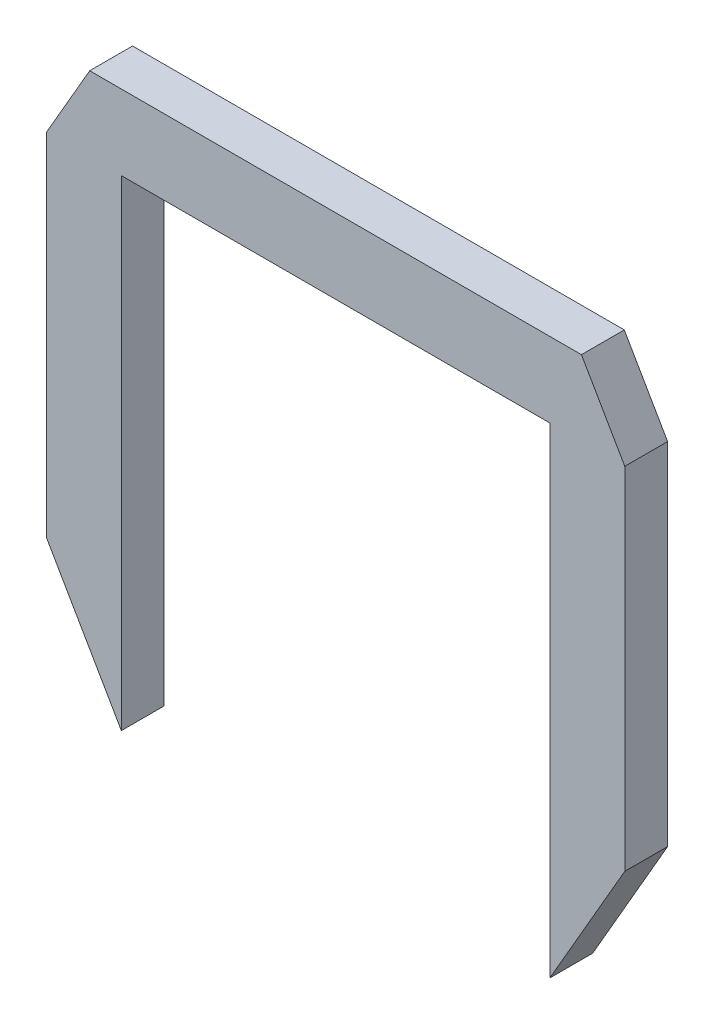
ISO-10303-21;
HEADER;
FILE_DESCRIPTION(('STEP AP214'),'2;1');
FILE_NAME('part.step','',(''),(''),'','','');
FILE_SCHEMA(('AUTOMOTIVE_DESIGN { 1 0 10303 214 1 1 1 1 }'));
ENDSEC;
DATA;
#1=APPLICATION_CONTEXT('core data for automotive mechanical design processes');
#2=APPLICATION_PROTOCOL_DEFINITION('international standard','automotive_design',2000,#1);
#3=PRODUCT_CONTEXT('',#1,'mechanical');
#4=PRODUCT('Part','Part','',(#3));
#5=PRODUCT_RELATED_PRODUCT_CATEGORY('part','',(#4));
#6=PRODUCT_DEFINITION_FORMATION('','',#4);
#7=PRODUCT_DEFINITION_CONTEXT('part definition',#1,'design');
#8=PRODUCT_DEFINITION('design','',#6,#7);
#9=PRODUCT_DEFINITION_SHAPE('','',#8);
#10=(LENGTH_UNIT() NAMED_UNIT(*) SI_UNIT(.MILLI.,.METRE.));
#11=(NAMED_UNIT(*) PLANE_ANGLE_UNIT() SI_UNIT($,.RADIAN.));
#12=(NAMED_UNIT(*) SI_UNIT($,.STERADIAN.) SOLID_ANGLE_UNIT());
#13=UNCERTAINTY_MEASURE_WITH_UNIT(LENGTH_MEASURE(1.E-05),#10,'distance_accuracy_value','');
#14=(GEOMETRIC_REPRESENTATION_CONTEXT(3) GLOBAL_UNCERTAINTY_ASSIGNED_CONTEXT((#13)) GLOBAL_UNIT_ASSIGNED_CONTEXT((#10,
#11,#12)) REPRESENTATION_CONTEXT('',''));
#15=CARTESIAN_POINT('',(0.,0.,0.));
#16=DIRECTION('',(0.,0.,1.));
#17=DIRECTION('',(1.,0.,0.));
#18=AXIS2_PLACEMENT_3D('',#15,#16,#17);
#19=CARTESIAN_POINT('',(20.,-21.7653555616953,4.));
#20=DIRECTION('',(-0.866025403784442,0.499999999999995,0.));
#21=DIRECTION('',(-0.499999999999995,-0.866025403784442,0.));
#22=AXIS2_PLACEMENT_3D('',#19,#20,#21);
#23=PLANE('',#22);
#24=DIRECTION('',(0.499999999999995,0.866025403784442,0.));
#25=VECTOR('',#24,1.);
#26=CARTESIAN_POINT('',(20.,-21.7653555616953,0.));
#27=LINE('',#26,#25);
#28=CARTESIAN_POINT('',(20.,-21.7653555616953,0.));
#29=VERTEX_POINT('',#28);
#30=CARTESIAN_POINT('',(27.,-9.64099990871295,0.));
#31=VERTEX_POINT('',#30);
#32=EDGE_CURVE('E156',#29,#31,#27,.T.);
#33=ORIENTED_EDGE('',*,*,#32,.T.);
#34=DIRECTION('',(0.,0.,-1.));
#35=VECTOR('',#34,1.);
#36=CARTESIAN_POINT('',(27.,-9.64099990871295,4.));
#37=LINE('',#36,#35);
#38=CARTESIAN_POINT('',(27.,-9.64099990871295,4.));
#39=VERTEX_POINT('',#38);
#40=EDGE_CURVE('E48',#39,#31,#37,.T.);
#41=ORIENTED_EDGE('',*,*,#40,.F.);
#42=DIRECTION('',(0.499999999999995,0.866025403784442,0.));
#43=VECTOR('',#42,1.);
#44=CARTESIAN_POINT('',(20.,-21.7653555616953,4.));
#45=LINE('',#44,#43);
#46=CARTESIAN_POINT('',(20.,-21.7653555616953,4.));
#47=VERTEX_POINT('',#46);
#48=EDGE_CURVE('E105',#47,#39,#45,.T.);
#49=ORIENTED_EDGE('',*,*,#48,.F.);
#50=DIRECTION('',(0.,0.,-1.));
#51=VECTOR('',#50,1.);
#52=CARTESIAN_POINT('',(20.,-21.7653555616953,4.));
#53=LINE('',#52,#51);
#54=EDGE_CURVE('E11',#47,#29,#53,.T.);
#55=ORIENTED_EDGE('',*,*,#54,.T.);
#56=EDGE_LOOP('',(#33,#41,#49,#55));
#57=FACE_BOUND('',#56,.T.);
#58=ADVANCED_FACE('F39',(#57),#23,.F.);
#59=CARTESIAN_POINT('',(27.,23.1069823973092,4.));
#60=DIRECTION('',(-1.,0.,0.));
#61=DIRECTION('',(0.,-1.,0.));
#62=AXIS2_PLACEMENT_3D('',#59,#60,#61);
#63=PLANE('',#62);
#64=DIRECTION('',(0.,1.,0.));
#65=VECTOR('',#64,1.);
#66=CARTESIAN_POINT('',(27.,23.1069823973092,0.));
#67=LINE('',#66,#65);
#68=CARTESIAN_POINT('',(27.,23.1069823973092,0.));
#69=VERTEX_POINT('',#68);
#70=EDGE_CURVE('E159',#31,#69,#67,.T.);
#71=ORIENTED_EDGE('',*,*,#70,.T.);
#72=DIRECTION('',(0.,0.,-1.));
#73=VECTOR('',#72,1.);
#74=CARTESIAN_POINT('',(27.,23.1069823973092,4.));
#75=LINE('',#74,#73);
#76=CARTESIAN_POINT('',(27.,23.1069823973092,4.));
#77=VERTEX_POINT('',#76);
#78=EDGE_CURVE('E201',#77,#69,#75,.T.);
#79=ORIENTED_EDGE('',*,*,#78,.F.);
#80=DIRECTION('',(0.,1.,0.));
#81=VECTOR('',#80,1.);
#82=CARTESIAN_POINT('',(27.,23.1069823973092,4.));
#83=LINE('',#82,#81);
#84=EDGE_CURVE('E211',#39,#77,#83,.T.);
#85=ORIENTED_EDGE('',*,*,#84,.F.);
#86=ORIENTED_EDGE('',*,*,#40,.T.);
#87=EDGE_LOOP('',(#71,#79,#85,#86));
#88=FACE_BOUND('',#87,.T.);
#89=ADVANCED_FACE('F209',(#88),#63,.F.);
#90=CARTESIAN_POINT('',(27.,23.1069823973092,4.));
#91=DIRECTION('',(-0.866025403784442,-0.499999999999995,0.));
#92=DIRECTION('',(0.499999999999995,-0.866025403784442,0.));
#93=AXIS2_PLACEMENT_3D('',#90,#91,#92);
#94=PLANE('',#93);
#95=DIRECTION('',(-0.499999999999995,0.866025403784442,0.));
#96=VECTOR('',#95,1.);
#97=CARTESIAN_POINT('',(27.,23.1069823973092,0.));
#98=LINE('',#97,#96);
#99=CARTESIAN_POINT('',(22.9551529161837,30.112863055326,0.));
#100=VERTEX_POINT('',#99);
#101=EDGE_CURVE('E162',#69,#100,#98,.T.);
#102=ORIENTED_EDGE('',*,*,#101,.T.);
#103=DIRECTION('',(0.,0.,-1.));
#104=VECTOR('',#103,1.);
#105=CARTESIAN_POINT('',(22.9551529161837,30.112863055326,4.));
#106=LINE('',#105,#104);
#107=CARTESIAN_POINT('',(22.9551529161837,30.112863055326,4.));
#108=VERTEX_POINT('',#107);
#109=EDGE_CURVE('E197',#108,#100,#106,.T.);
#110=ORIENTED_EDGE('',*,*,#109,.F.);
#111=DIRECTION('',(-0.499999999999995,0.866025403784442,0.));
#112=VECTOR('',#111,1.);
#113=CARTESIAN_POINT('',(27.,23.1069823973092,4.));
#114=LINE('',#113,#112);
#115=EDGE_CURVE('E231',#77,#108,#114,.T.);
#116=ORIENTED_EDGE('',*,*,#115,.F.);
#117=ORIENTED_EDGE('',*,*,#78,.T.);
#118=EDGE_LOOP('',(#102,#110,#116,#117));
#119=FACE_BOUND('',#118,.T.);
#120=ADVANCED_FACE('F221',(#119),#94,.F.);
#121=CARTESIAN_POINT('',(22.9551529161837,30.112863055326,4.));
#122=DIRECTION('',(0.,-1.,0.));
#123=DIRECTION('',(1.,0.,0.));
#124=AXIS2_PLACEMENT_3D('',#121,#122,#123);
#125=PLANE('',#124);
#126=DIRECTION('',(-1.,0.,0.));
#127=VECTOR('',#126,1.);
#128=CARTESIAN_POINT('',(22.9551529161837,30.112863055326,0.));
#129=LINE('',#128,#127);
#130=CARTESIAN_POINT('',(-22.9585481156727,30.112863055326,0.));
#131=VERTEX_POINT('',#130);
#132=EDGE_CURVE('E165',#100,#131,#129,.T.);
#133=ORIENTED_EDGE('',*,*,#132,.T.);
#134=DIRECTION('',(0.,0.,-1.));
#135=VECTOR('',#134,1.);
#136=CARTESIAN_POINT('',(-22.9585481156727,30.112863055326,4.));
#137=LINE('',#136,#135);
#138=CARTESIAN_POINT('',(-22.9585481156727,30.112863055326,4.));
#139=VERTEX_POINT('',#138);
#140=EDGE_CURVE('E193',#139,#131,#137,.T.);
#141=ORIENTED_EDGE('',*,*,#140,.F.);
#142=DIRECTION('',(-1.,0.,0.));
#143=VECTOR('',#142,1.);
#144=CARTESIAN_POINT('',(22.9551529161837,30.112863055326,4.));
#145=LINE('',#144,#143);
#146=EDGE_CURVE('E227',#108,#139,#145,.T.);
#147=ORIENTED_EDGE('',*,*,#146,.F.);
#148=ORIENTED_EDGE('',*,*,#109,.T.);
#149=EDGE_LOOP('',(#133,#141,#147,#148));
#150=FACE_BOUND('',#149,.T.);
#151=ADVANCED_FACE('F225',(#150),#125,.F.);
#152=CARTESIAN_POINT('',(-22.9585481156727,30.112863055326,4.));
#153=DIRECTION('',(0.866025403784442,-0.499999999999995,0.));
#154=DIRECTION('',(0.499999999999995,0.866025403784442,0.));
#155=AXIS2_PLACEMENT_3D('',#152,#153,#154);
#156=PLANE('',#155);
#157=DIRECTION('',(-0.499999999999995,-0.866025403784442,0.));
#158=VECTOR('',#157,1.);
#159=CARTESIAN_POINT('',(-22.9585481156727,30.112863055326,0.));
#160=LINE('',#159,#158);
#161=CARTESIAN_POINT('',(-27.,23.112863055326,0.));
#162=VERTEX_POINT('',#161);
#163=EDGE_CURVE('E168',#131,#162,#160,.T.);
#164=ORIENTED_EDGE('',*,*,#163,.T.);
#165=DIRECTION('',(0.,0.,-1.));
#166=VECTOR('',#165,1.);
#167=CARTESIAN_POINT('',(-27.,23.112863055326,4.));
#168=LINE('',#167,#166);
#169=CARTESIAN_POINT('',(-27.,23.112863055326,4.));
#170=VERTEX_POINT('',#169);
#171=EDGE_CURVE('E189',#170,#162,#168,.T.);
#172=ORIENTED_EDGE('',*,*,#171,.F.);
#173=DIRECTION('',(-0.499999999999995,-0.866025403784442,0.));
#174=VECTOR('',#173,1.);
#175=CARTESIAN_POINT('',(-22.9585481156727,30.112863055326,4.));
#176=LINE('',#175,#174);
#177=EDGE_CURVE('E230',#139,#170,#176,.T.);
#178=ORIENTED_EDGE('',*,*,#177,.F.);
#179=ORIENTED_EDGE('',*,*,#140,.T.);
#180=EDGE_LOOP('',(#164,#172,#178,#179));
#181=FACE_BOUND('',#180,.T.);
#182=ADVANCED_FACE('F256',(#181),#156,.F.);
#183=CARTESIAN_POINT('',(-27.,-9.64099990871296,4.));
#184=DIRECTION('',(1.,0.,0.));
#185=DIRECTION('',(0.,0.,-1.));
#186=AXIS2_PLACEMENT_3D('',#183,#184,#185);
#187=PLANE('',#186);
#188=DIRECTION('',(0.,-1.,0.));
#189=VECTOR('',#188,1.);
#190=CARTESIAN_POINT('',(-27.,-9.64099990871296,0.));
#191=LINE('',#190,#189);
#192=CARTESIAN_POINT('',(-27.,-9.64099990871296,0.));
#193=VERTEX_POINT('',#192);
#194=EDGE_CURVE('E171',#162,#193,#191,.T.);
#195=ORIENTED_EDGE('',*,*,#194,.T.);
#196=DIRECTION('',(0.,0.,-1.));
#197=VECTOR('',#196,1.);
#198=CARTESIAN_POINT('',(-27.,-9.64099990871296,4.));
#199=LINE('',#198,#197);
#200=CARTESIAN_POINT('',(-27.,-9.64099990871296,4.));
#201=VERTEX_POINT('',#200);
#202=EDGE_CURVE('E143',#201,#193,#199,.T.);
#203=ORIENTED_EDGE('',*,*,#202,.F.);
#204=DIRECTION('',(0.,-1.,0.));
#205=VECTOR('',#204,1.);
#206=CARTESIAN_POINT('',(-27.,-9.64099990871296,4.));
#207=LINE('',#206,#205);
#208=EDGE_CURVE('E131',#170,#201,#207,.T.);
#209=ORIENTED_EDGE('',*,*,#208,.F.);
#210=ORIENTED_EDGE('',*,*,#171,.T.);
#211=EDGE_LOOP('',(#195,#203,#209,#210));
#212=FACE_BOUND('',#211,.T.);
#213=ADVANCED_FACE('F259',(#212),#187,.F.);
#214=CARTESIAN_POINT('',(-20.,-21.7653555616953,4.));
#215=DIRECTION('',(0.866025403784442,0.499999999999995,0.));
#216=DIRECTION('',(-0.499999999999995,0.866025403784442,0.));
#217=AXIS2_PLACEMENT_3D('',#214,#215,#216);
#218=PLANE('',#217);
#219=DIRECTION('',(0.499999999999995,-0.866025403784442,0.));
#220=VECTOR('',#219,1.);
#221=CARTESIAN_POINT('',(-20.,-21.7653555616953,0.));
#222=LINE('',#221,#220);
#223=CARTESIAN_POINT('',(-20.,-21.7653555616953,0.));
#224=VERTEX_POINT('',#223);
#225=EDGE_CURVE('E141',#193,#224,#222,.T.);
#226=ORIENTED_EDGE('',*,*,#225,.T.);
#227=DIRECTION('',(0.,0.,-1.));
#228=VECTOR('',#227,1.);
#229=CARTESIAN_POINT('',(-20.,-21.7653555616953,4.));
#230=LINE('',#229,#228);
#231=CARTESIAN_POINT('',(-20.,-21.7653555616953,4.));
#232=VERTEX_POINT('',#231);
#233=EDGE_CURVE('E138',#232,#224,#230,.T.);
#234=ORIENTED_EDGE('',*,*,#233,.F.);
#235=DIRECTION('',(0.499999999999995,-0.866025403784442,0.));
#236=VECTOR('',#235,1.);
#237=CARTESIAN_POINT('',(-20.,-21.7653555616953,4.));
#238=LINE('',#237,#236);
#239=EDGE_CURVE('E125',#201,#232,#238,.T.);
#240=ORIENTED_EDGE('',*,*,#239,.F.);
#241=ORIENTED_EDGE('',*,*,#202,.T.);
#242=EDGE_LOOP('',(#226,#234,#240,#241));
#243=FACE_BOUND('',#242,.T.);
#244=ADVANCED_FACE('F139',(#243),#218,.F.);
#245=CARTESIAN_POINT('',(-20.,23.112863055326,4.));
#246=DIRECTION('',(-1.,0.,0.));
#247=DIRECTION('',(0.,-1.,0.));
#248=AXIS2_PLACEMENT_3D('',#245,#246,#247);
#249=PLANE('',#248);
#250=DIRECTION('',(0.,1.,0.));
#251=VECTOR('',#250,1.);
#252=CARTESIAN_POINT('',(-20.,23.112863055326,0.));
#253=LINE('',#252,#251);
#254=CARTESIAN_POINT('',(-20.,23.112863055326,0.));
#255=VERTEX_POINT('',#254);
#256=EDGE_CURVE('E91',#224,#255,#253,.T.);
#257=ORIENTED_EDGE('',*,*,#256,.T.);
#258=DIRECTION('',(0.,0.,-1.));
#259=VECTOR('',#258,1.);
#260=CARTESIAN_POINT('',(-20.,23.112863055326,4.));
#261=LINE('',#260,#259);
#262=CARTESIAN_POINT('',(-20.,23.112863055326,4.));
#263=VERTEX_POINT('',#262);
#264=EDGE_CURVE('E144',#263,#255,#261,.T.);
#265=ORIENTED_EDGE('',*,*,#264,.F.);
#266=DIRECTION('',(0.,1.,0.));
#267=VECTOR('',#266,1.);
#268=CARTESIAN_POINT('',(-20.,-16.887136944674,4.));
#269=LINE('',#268,#267);
#270=EDGE_CURVE('E129',#232,#263,#269,.T.);
#271=ORIENTED_EDGE('',*,*,#270,.F.);
#272=ORIENTED_EDGE('',*,*,#233,.T.);
#273=EDGE_LOOP('',(#257,#265,#271,#272));
#274=FACE_BOUND('',#273,.T.);
#275=ADVANCED_FACE('F146',(#274),#249,.F.);
#276=CARTESIAN_POINT('',(-20.,23.112863055326,4.));
#277=DIRECTION('',(0.,1.,0.));
#278=DIRECTION('',(-1.,0.,0.));
#279=AXIS2_PLACEMENT_3D('',#276,#277,#278);
#280=PLANE('',#279);
#281=DIRECTION('',(1.,0.,0.));
#282=VECTOR('',#281,1.);
#283=CARTESIAN_POINT('',(-20.,23.112863055326,0.));
#284=LINE('',#283,#282);
#285=CARTESIAN_POINT('',(20.,23.112863055326,0.));
#286=VERTEX_POINT('',#285);
#287=EDGE_CURVE('E98',#255,#286,#284,.T.);
#288=ORIENTED_EDGE('',*,*,#287,.T.);
#289=DIRECTION('',(0.,0.,-1.));
#290=VECTOR('',#289,1.);
#291=CARTESIAN_POINT('',(20.,23.112863055326,4.));
#292=LINE('',#291,#290);
#293=CARTESIAN_POINT('',(20.,23.112863055326,4.));
#294=VERTEX_POINT('',#293);
#295=EDGE_CURVE('E152',#294,#286,#292,.T.);
#296=ORIENTED_EDGE('',*,*,#295,.F.);
#297=DIRECTION('',(1.,0.,0.));
#298=VECTOR('',#297,1.);
#299=CARTESIAN_POINT('',(-20.,23.112863055326,4.));
#300=LINE('',#299,#298);
#301=EDGE_CURVE('E149',#263,#294,#300,.T.);
#302=ORIENTED_EDGE('',*,*,#301,.F.);
#303=ORIENTED_EDGE('',*,*,#264,.T.);
#304=EDGE_LOOP('',(#288,#296,#302,#303));
#305=FACE_BOUND('',#304,.T.);
#306=ADVANCED_FACE('F268',(#305),#280,.F.);
#307=CARTESIAN_POINT('',(20.,23.112863055326,4.));
#308=DIRECTION('',(1.,0.,0.));
#309=DIRECTION('',(0.,0.,-1.));
#310=AXIS2_PLACEMENT_3D('',#307,#308,#309);
#311=PLANE('',#310);
#312=DIRECTION('',(0.,-1.,0.));
#313=VECTOR('',#312,1.);
#314=CARTESIAN_POINT('',(20.,23.112863055326,0.));
#315=LINE('',#314,#313);
#316=EDGE_CURVE('E180',#286,#29,#315,.T.);
#317=ORIENTED_EDGE('',*,*,#316,.T.);
#318=ORIENTED_EDGE('',*,*,#54,.F.);
#319=DIRECTION('',(0.,-1.,0.));
#320=VECTOR('',#319,1.);
#321=CARTESIAN_POINT('',(20.,-16.887136944674,4.));
#322=LINE('',#321,#320);
#323=EDGE_CURVE('E56',#294,#47,#322,.T.);
#324=ORIENTED_EDGE('',*,*,#323,.F.);
#325=ORIENTED_EDGE('',*,*,#295,.T.);
#326=EDGE_LOOP('',(#317,#318,#324,#325));
#327=FACE_BOUND('',#326,.T.);
#328=ADVANCED_FACE('F244',(#327),#311,.F.);
#329=CARTESIAN_POINT('',(0.,0.,4.));
#330=DIRECTION('',(0.,0.,-1.));
#331=DIRECTION('',(-1.,0.,0.));
#332=AXIS2_PLACEMENT_3D('',#329,#330,#331);
#333=PLANE('',#332);
#334=ORIENTED_EDGE('',*,*,#323,.T.);
#335=ORIENTED_EDGE('',*,*,#48,.T.);
#336=ORIENTED_EDGE('',*,*,#84,.T.);
#337=ORIENTED_EDGE('',*,*,#115,.T.);
#338=ORIENTED_EDGE('',*,*,#146,.T.);
#339=ORIENTED_EDGE('',*,*,#177,.T.);
#340=ORIENTED_EDGE('',*,*,#208,.T.);
#341=ORIENTED_EDGE('',*,*,#239,.T.);
#342=ORIENTED_EDGE('',*,*,#270,.T.);
#343=ORIENTED_EDGE('',*,*,#301,.T.);
#344=EDGE_LOOP('',(#334,#335,#336,#337,#338,#339,#340,#341,#342,#343));
#345=FACE_BOUND('',#344,.T.);
#346=ADVANCED_FACE('F127',(#345),#333,.F.);
#347=CARTESIAN_POINT('',(0.,0.,0.));
#348=DIRECTION('',(0.,0.,-1.));
#349=DIRECTION('',(-1.,0.,0.));
#350=AXIS2_PLACEMENT_3D('',#347,#348,#349);
#351=PLANE('',#350);
#352=ORIENTED_EDGE('',*,*,#32,.F.);
#353=ORIENTED_EDGE('',*,*,#316,.F.);
#354=ORIENTED_EDGE('',*,*,#287,.F.);
#355=ORIENTED_EDGE('',*,*,#256,.F.);
#356=ORIENTED_EDGE('',*,*,#225,.F.);
#357=ORIENTED_EDGE('',*,*,#194,.F.);
#358=ORIENTED_EDGE('',*,*,#163,.F.);
#359=ORIENTED_EDGE('',*,*,#132,.F.);
#360=ORIENTED_EDGE('',*,*,#101,.F.);
#361=ORIENTED_EDGE('',*,*,#70,.F.);
#362=EDGE_LOOP('',(#352,#353,#354,#355,#356,#357,#358,#359,#360,#361));
#363=FACE_BOUND('',#362,.T.);
#364=ADVANCED_FACE('F215',(#363),#351,.T.);
#365=CLOSED_SHELL('',(#58,#89,#120,#151,#182,#213,#244,#275,#306,#328,#346,#364));
#366=MANIFOLD_SOLID_BREP('B2',#365);
#367=ADVANCED_BREP_SHAPE_REPRESENTATION('',(#18,#366),#14);
#368=SHAPE_DEFINITION_REPRESENTATION(#9,#367);
ENDSEC;
END-ISO-10303-21;
